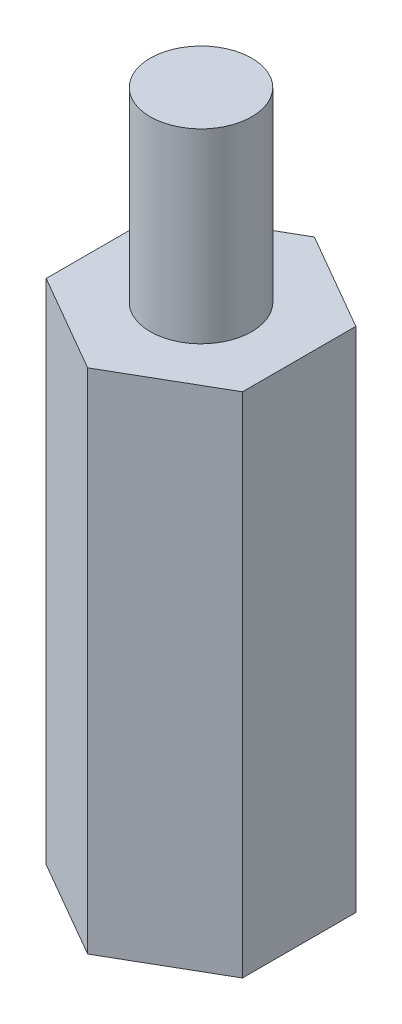
ISO-10303-21;
HEADER;
FILE_DESCRIPTION(('STEP AP214'),'2;1');
FILE_NAME('part.step','',(''),(''),'','','');
FILE_SCHEMA(('AUTOMOTIVE_DESIGN { 1 0 10303 214 1 1 1 1 }'));
ENDSEC;
DATA;
#1=APPLICATION_CONTEXT('core data for automotive mechanical design processes');
#2=APPLICATION_PROTOCOL_DEFINITION('international standard','automotive_design',2000,#1);
#3=PRODUCT_CONTEXT('',#1,'mechanical');
#4=PRODUCT('Part','Part','',(#3));
#5=PRODUCT_RELATED_PRODUCT_CATEGORY('part','',(#4));
#6=PRODUCT_DEFINITION_FORMATION('','',#4);
#7=PRODUCT_DEFINITION_CONTEXT('part definition',#1,'design');
#8=PRODUCT_DEFINITION('design','',#6,#7);
#9=PRODUCT_DEFINITION_SHAPE('','',#8);
#10=(LENGTH_UNIT() NAMED_UNIT(*) SI_UNIT(.MILLI.,.METRE.));
#11=(NAMED_UNIT(*) PLANE_ANGLE_UNIT() SI_UNIT($,.RADIAN.));
#12=(NAMED_UNIT(*) SI_UNIT($,.STERADIAN.) SOLID_ANGLE_UNIT());
#13=UNCERTAINTY_MEASURE_WITH_UNIT(LENGTH_MEASURE(1.E-05),#10,'distance_accuracy_value','');
#14=(GEOMETRIC_REPRESENTATION_CONTEXT(3) GLOBAL_UNCERTAINTY_ASSIGNED_CONTEXT((#13)) GLOBAL_UNIT_ASSIGNED_CONTEXT((#10,
#11,#12)) REPRESENTATION_CONTEXT('',''));
#15=CARTESIAN_POINT('',(0.,0.,0.));
#16=DIRECTION('',(0.,0.,1.));
#17=DIRECTION('',(1.,0.,0.));
#18=AXIS2_PLACEMENT_3D('',#15,#16,#17);
#19=CARTESIAN_POINT('',(0.,13.,0.));
#20=DIRECTION('',(0.,-1.,0.));
#21=DIRECTION('',(0.,0.,-1.));
#22=AXIS2_PLACEMENT_3D('',#19,#20,#21);
#23=CYLINDRICAL_SURFACE('',#22,1.5);
#24=CARTESIAN_POINT('',(0.,13.,0.));
#25=DIRECTION('',(0.,1.,0.));
#26=DIRECTION('',(0.,0.,1.));
#27=AXIS2_PLACEMENT_3D('',#24,#25,#26);
#28=CIRCLE('',#27,1.5);
#29=CARTESIAN_POINT('',(0.,13.,1.5));
#30=VERTEX_POINT('',#29);
#31=EDGE_CURVE('E11',#30,#30,#28,.T.);
#32=ORIENTED_EDGE('',*,*,#31,.F.);
#33=EDGE_LOOP('',(#32));
#34=FACE_BOUND('',#33,.T.);
#35=CARTESIAN_POINT('',(0.,7.5,0.));
#36=DIRECTION('',(0.,1.,0.));
#37=DIRECTION('',(0.,0.,1.));
#38=AXIS2_PLACEMENT_3D('',#35,#36,#37);
#39=CIRCLE('',#38,1.5);
#40=CARTESIAN_POINT('',(0.,7.5,1.5));
#41=VERTEX_POINT('',#40);
#42=EDGE_CURVE('E48',#41,#41,#39,.T.);
#43=ORIENTED_EDGE('',*,*,#42,.T.);
#44=EDGE_LOOP('',(#43));
#45=FACE_BOUND('',#44,.T.);
#46=ADVANCED_FACE('F45',(#34,#45),#23,.T.);
#47=CARTESIAN_POINT('',(0.,13.,0.));
#48=DIRECTION('',(0.,1.,0.));
#49=DIRECTION('',(0.,0.,1.));
#50=AXIS2_PLACEMENT_3D('',#47,#48,#49);
#51=PLANE('',#50);
#52=ORIENTED_EDGE('',*,*,#31,.T.);
#53=EDGE_LOOP('',(#52));
#54=FACE_BOUND('',#53,.T.);
#55=ADVANCED_FACE('F60',(#54),#51,.T.);
#56=CARTESIAN_POINT('',(0.,7.5,0.));
#57=DIRECTION('',(0.,1.,0.));
#58=DIRECTION('',(0.,0.,1.));
#59=AXIS2_PLACEMENT_3D('',#56,#57,#58);
#60=PLANE('',#59);
#61=ORIENTED_EDGE('',*,*,#42,.F.);
#62=EDGE_LOOP('',(#61));
#63=FACE_BOUND('',#62,.T.);
#64=ADVANCED_FACE('F58',(#63),#60,.F.);
#65=CLOSED_SHELL('',(#46,#55,#64));
#66=MANIFOLD_SOLID_BREP('B2',#65);
#67=CARTESIAN_POINT('',(0.,7.5,0.));
#68=DIRECTION('',(0.,1.,0.));
#69=DIRECTION('',(0.,0.,1.));
#70=AXIS2_PLACEMENT_3D('',#67,#68,#69);
#71=PLANE('',#70);
#72=DIRECTION('',(0.866025403784442,0.,0.499999999999995));
#73=VECTOR('',#72,1.);
#74=CARTESIAN_POINT('',(-2.89999999999998,7.5,1.67431578064995));
#75=LINE('',#74,#73);
#76=CARTESIAN_POINT('',(-2.89999999999998,7.5,1.67431578064995));
#77=VERTEX_POINT('',#76);
#78=CARTESIAN_POINT('',(0.,7.5,3.34863156129983));
#79=VERTEX_POINT('',#78);
#80=EDGE_CURVE('E188',#77,#79,#75,.T.);
#81=ORIENTED_EDGE('',*,*,#80,.T.);
#82=DIRECTION('',(0.866025403784438,0.,-0.500000000000001));
#83=VECTOR('',#82,1.);
#84=CARTESIAN_POINT('',(0.,7.5,3.34863156129983));
#85=LINE('',#84,#83);
#86=CARTESIAN_POINT('',(2.90000000000001,7.5,1.67431578064991));
#87=VERTEX_POINT('',#86);
#88=EDGE_CURVE('E146',#79,#87,#85,.T.);
#89=ORIENTED_EDGE('',*,*,#88,.T.);
#90=DIRECTION('',(0.,0.,-1.));
#91=VECTOR('',#90,1.);
#92=CARTESIAN_POINT('',(2.90000000000001,7.5,1.67431578064991));
#93=LINE('',#92,#91);
#94=CARTESIAN_POINT('',(2.89999999999999,7.5,-1.67431578064993));
#95=VERTEX_POINT('',#94);
#96=EDGE_CURVE('E159',#87,#95,#93,.T.);
#97=ORIENTED_EDGE('',*,*,#96,.T.);
#98=DIRECTION('',(-0.866025403784442,0.,-0.499999999999995));
#99=VECTOR('',#98,1.);
#100=CARTESIAN_POINT('',(2.89999999999999,7.5,-1.67431578064993));
#101=LINE('',#100,#99);
#102=CARTESIAN_POINT('',(0.,7.5,-3.34863156129983));
#103=VERTEX_POINT('',#102);
#104=EDGE_CURVE('E153',#95,#103,#101,.T.);
#105=ORIENTED_EDGE('',*,*,#104,.T.);
#106=DIRECTION('',(-0.866025403784435,0.,0.500000000000007));
#107=VECTOR('',#106,1.);
#108=CARTESIAN_POINT('',(0.,7.5,-3.34863156129983));
#109=LINE('',#108,#107);
#110=CARTESIAN_POINT('',(-2.90000000000002,7.5,-1.67431578064989));
#111=VERTEX_POINT('',#110);
#112=EDGE_CURVE('E157',#103,#111,#109,.T.);
#113=ORIENTED_EDGE('',*,*,#112,.T.);
#114=DIRECTION('',(0.,0.,1.));
#115=VECTOR('',#114,1.);
#116=CARTESIAN_POINT('',(-2.90000000000002,7.5,-1.67431578064989));
#117=LINE('',#116,#115);
#118=EDGE_CURVE('E109',#111,#77,#117,.T.);
#119=ORIENTED_EDGE('',*,*,#118,.T.);
#120=EDGE_LOOP('',(#81,#89,#97,#105,#113,#119));
#121=FACE_BOUND('',#120,.T.);
#122=CARTESIAN_POINT('',(0.,7.5,0.));
#123=DIRECTION('',(0.,1.,0.));
#124=DIRECTION('',(0.,0.,1.));
#125=AXIS2_PLACEMENT_3D('',#122,#123,#124);
#126=CIRCLE('',#125,1.5);
#127=CARTESIAN_POINT('',(0.,7.5,1.5));
#128=VERTEX_POINT('',#127);
#129=EDGE_CURVE('E181',#128,#128,#126,.T.);
#130=ORIENTED_EDGE('',*,*,#129,.F.);
#131=EDGE_LOOP('',(#130));
#132=FACE_BOUND('',#131,.T.);
#133=ADVANCED_FACE('F92',(#121,#132),#71,.T.);
#134=CARTESIAN_POINT('',(0.,-7.5,0.));
#135=DIRECTION('',(0.,1.,0.));
#136=DIRECTION('',(0.,0.,1.));
#137=AXIS2_PLACEMENT_3D('',#134,#135,#136);
#138=PLANE('',#137);
#139=DIRECTION('',(0.866025403784442,0.,0.499999999999995));
#140=VECTOR('',#139,1.);
#141=CARTESIAN_POINT('',(-2.89999999999998,-7.5,1.67431578064995));
#142=LINE('',#141,#140);
#143=CARTESIAN_POINT('',(-2.89999999999998,-7.5,1.67431578064995));
#144=VERTEX_POINT('',#143);
#145=CARTESIAN_POINT('',(0.,-7.5,3.34863156129983));
#146=VERTEX_POINT('',#145);
#147=EDGE_CURVE('E177',#144,#146,#142,.T.);
#148=ORIENTED_EDGE('',*,*,#147,.F.);
#149=DIRECTION('',(0.,0.,1.));
#150=VECTOR('',#149,1.);
#151=CARTESIAN_POINT('',(-2.90000000000002,-7.5,-1.67431578064989));
#152=LINE('',#151,#150);
#153=CARTESIAN_POINT('',(-2.90000000000002,-7.5,-1.67431578064989));
#154=VERTEX_POINT('',#153);
#155=EDGE_CURVE('E138',#154,#144,#152,.T.);
#156=ORIENTED_EDGE('',*,*,#155,.F.);
#157=DIRECTION('',(-0.866025403784435,0.,0.500000000000007));
#158=VECTOR('',#157,1.);
#159=CARTESIAN_POINT('',(0.,-7.5,-3.34863156129983));
#160=LINE('',#159,#158);
#161=CARTESIAN_POINT('',(0.,-7.5,-3.34863156129983));
#162=VERTEX_POINT('',#161);
#163=EDGE_CURVE('E132',#162,#154,#160,.T.);
#164=ORIENTED_EDGE('',*,*,#163,.F.);
#165=DIRECTION('',(-0.866025403784442,0.,-0.499999999999995));
#166=VECTOR('',#165,1.);
#167=CARTESIAN_POINT('',(2.89999999999999,-7.5,-1.67431578064993));
#168=LINE('',#167,#166);
#169=CARTESIAN_POINT('',(2.89999999999999,-7.5,-1.67431578064993));
#170=VERTEX_POINT('',#169);
#171=EDGE_CURVE('E167',#170,#162,#168,.T.);
#172=ORIENTED_EDGE('',*,*,#171,.F.);
#173=DIRECTION('',(0.,0.,-1.));
#174=VECTOR('',#173,1.);
#175=CARTESIAN_POINT('',(2.90000000000001,-7.5,1.67431578064991));
#176=LINE('',#175,#174);
#177=CARTESIAN_POINT('',(2.90000000000001,-7.5,1.67431578064991));
#178=VERTEX_POINT('',#177);
#179=EDGE_CURVE('E183',#178,#170,#176,.T.);
#180=ORIENTED_EDGE('',*,*,#179,.F.);
#181=DIRECTION('',(0.866025403784438,0.,-0.500000000000001));
#182=VECTOR('',#181,1.);
#183=CARTESIAN_POINT('',(0.,-7.5,3.34863156129983));
#184=LINE('',#183,#182);
#185=EDGE_CURVE('E180',#146,#178,#184,.T.);
#186=ORIENTED_EDGE('',*,*,#185,.F.);
#187=EDGE_LOOP('',(#148,#156,#164,#172,#180,#186));
#188=FACE_BOUND('',#187,.T.);
#189=CARTESIAN_POINT('',(0.,-7.5,0.));
#190=DIRECTION('',(0.,1.,0.));
#191=DIRECTION('',(0.,0.,1.));
#192=AXIS2_PLACEMENT_3D('',#189,#190,#191);
#193=CIRCLE('',#192,1.5);
#194=CARTESIAN_POINT('',(0.,-7.5,1.5));
#195=VERTEX_POINT('',#194);
#196=EDGE_CURVE('E299',#195,#195,#193,.T.);
#197=ORIENTED_EDGE('',*,*,#196,.T.);
#198=EDGE_LOOP('',(#197));
#199=FACE_BOUND('',#198,.T.);
#200=ADVANCED_FACE('F197',(#188,#199),#138,.F.);
#201=CARTESIAN_POINT('',(-2.89999999999998,7.5,1.67431578064995));
#202=DIRECTION('',(0.499999999999995,0.,-0.866025403784442));
#203=DIRECTION('',(-0.866025403784442,0.,-0.499999999999995));
#204=AXIS2_PLACEMENT_3D('',#201,#202,#203);
#205=PLANE('',#204);
#206=ORIENTED_EDGE('',*,*,#147,.T.);
#207=DIRECTION('',(0.,-1.,0.));
#208=VECTOR('',#207,1.);
#209=CARTESIAN_POINT('',(0.,7.5,3.34863156129983));
#210=LINE('',#209,#208);
#211=EDGE_CURVE('E43',#79,#146,#210,.T.);
#212=ORIENTED_EDGE('',*,*,#211,.F.);
#213=ORIENTED_EDGE('',*,*,#80,.F.);
#214=DIRECTION('',(0.,-1.,0.));
#215=VECTOR('',#214,1.);
#216=CARTESIAN_POINT('',(-2.89999999999998,7.5,1.67431578064995));
#217=LINE('',#216,#215);
#218=EDGE_CURVE('E173',#77,#144,#217,.T.);
#219=ORIENTED_EDGE('',*,*,#218,.T.);
#220=EDGE_LOOP('',(#206,#212,#213,#219));
#221=FACE_BOUND('',#220,.T.);
#222=ADVANCED_FACE('F94',(#221),#205,.F.);
#223=CARTESIAN_POINT('',(0.,7.5,3.34863156129983));
#224=DIRECTION('',(-0.500000000000001,0.,-0.866025403784438));
#225=DIRECTION('',(-0.866025403784438,0.,0.500000000000001));
#226=AXIS2_PLACEMENT_3D('',#223,#224,#225);
#227=PLANE('',#226);
#228=ORIENTED_EDGE('',*,*,#185,.T.);
#229=DIRECTION('',(0.,-1.,0.));
#230=VECTOR('',#229,1.);
#231=CARTESIAN_POINT('',(2.90000000000001,7.5,1.67431578064991));
#232=LINE('',#231,#230);
#233=EDGE_CURVE('E101',#87,#178,#232,.T.);
#234=ORIENTED_EDGE('',*,*,#233,.F.);
#235=ORIENTED_EDGE('',*,*,#88,.F.);
#236=ORIENTED_EDGE('',*,*,#211,.T.);
#237=EDGE_LOOP('',(#228,#234,#235,#236));
#238=FACE_BOUND('',#237,.T.);
#239=ADVANCED_FACE('F222',(#238),#227,.F.);
#240=CARTESIAN_POINT('',(2.90000000000001,7.5,1.67431578064991));
#241=DIRECTION('',(-1.,0.,0.));
#242=DIRECTION('',(0.,0.,1.));
#243=AXIS2_PLACEMENT_3D('',#240,#241,#242);
#244=PLANE('',#243);
#245=ORIENTED_EDGE('',*,*,#179,.T.);
#246=DIRECTION('',(0.,-1.,0.));
#247=VECTOR('',#246,1.);
#248=CARTESIAN_POINT('',(2.89999999999999,7.5,-1.67431578064993));
#249=LINE('',#248,#247);
#250=EDGE_CURVE('E168',#95,#170,#249,.T.);
#251=ORIENTED_EDGE('',*,*,#250,.F.);
#252=ORIENTED_EDGE('',*,*,#96,.F.);
#253=ORIENTED_EDGE('',*,*,#233,.T.);
#254=EDGE_LOOP('',(#245,#251,#252,#253));
#255=FACE_BOUND('',#254,.T.);
#256=ADVANCED_FACE('F194',(#255),#244,.F.);
#257=CARTESIAN_POINT('',(2.89999999999999,7.5,-1.67431578064993));
#258=DIRECTION('',(-0.499999999999995,0.,0.866025403784441));
#259=DIRECTION('',(0.866025403784442,0.,0.499999999999995));
#260=AXIS2_PLACEMENT_3D('',#257,#258,#259);
#261=PLANE('',#260);
#262=ORIENTED_EDGE('',*,*,#171,.T.);
#263=DIRECTION('',(0.,-1.,0.));
#264=VECTOR('',#263,1.);
#265=CARTESIAN_POINT('',(0.,7.5,-3.34863156129983));
#266=LINE('',#265,#264);
#267=EDGE_CURVE('E164',#103,#162,#266,.T.);
#268=ORIENTED_EDGE('',*,*,#267,.F.);
#269=ORIENTED_EDGE('',*,*,#104,.F.);
#270=ORIENTED_EDGE('',*,*,#250,.T.);
#271=EDGE_LOOP('',(#262,#268,#269,#270));
#272=FACE_BOUND('',#271,.T.);
#273=ADVANCED_FACE('F165',(#272),#261,.F.);
#274=CARTESIAN_POINT('',(0.,7.5,-3.34863156129983));
#275=DIRECTION('',(0.500000000000007,0.,0.866025403784435));
#276=DIRECTION('',(0.866025403784435,0.,-0.500000000000007));
#277=AXIS2_PLACEMENT_3D('',#274,#275,#276);
#278=PLANE('',#277);
#279=ORIENTED_EDGE('',*,*,#163,.T.);
#280=DIRECTION('',(0.,-1.,0.));
#281=VECTOR('',#280,1.);
#282=CARTESIAN_POINT('',(-2.90000000000002,7.5,-1.67431578064989));
#283=LINE('',#282,#281);
#284=EDGE_CURVE('E169',#111,#154,#283,.T.);
#285=ORIENTED_EDGE('',*,*,#284,.F.);
#286=ORIENTED_EDGE('',*,*,#112,.F.);
#287=ORIENTED_EDGE('',*,*,#267,.T.);
#288=EDGE_LOOP('',(#279,#285,#286,#287));
#289=FACE_BOUND('',#288,.T.);
#290=ADVANCED_FACE('F171',(#289),#278,.F.);
#291=CARTESIAN_POINT('',(-2.90000000000002,7.5,-1.67431578064989));
#292=DIRECTION('',(1.,0.,0.));
#293=DIRECTION('',(0.,0.,-1.));
#294=AXIS2_PLACEMENT_3D('',#291,#292,#293);
#295=PLANE('',#294);
#296=ORIENTED_EDGE('',*,*,#155,.T.);
#297=ORIENTED_EDGE('',*,*,#218,.F.);
#298=ORIENTED_EDGE('',*,*,#118,.F.);
#299=ORIENTED_EDGE('',*,*,#284,.T.);
#300=EDGE_LOOP('',(#296,#297,#298,#299));
#301=FACE_BOUND('',#300,.T.);
#302=ADVANCED_FACE('F202',(#301),#295,.F.);
#303=CARTESIAN_POINT('',(0.,7.5,0.));
#304=DIRECTION('',(0.,-1.,0.));
#305=DIRECTION('',(0.,0.,-1.));
#306=AXIS2_PLACEMENT_3D('',#303,#304,#305);
#307=CYLINDRICAL_SURFACE('',#306,1.5);
#308=ORIENTED_EDGE('',*,*,#129,.T.);
#309=EDGE_LOOP('',(#308));
#310=FACE_BOUND('',#309,.T.);
#311=ORIENTED_EDGE('',*,*,#196,.F.);
#312=EDGE_LOOP('',(#311));
#313=FACE_BOUND('',#312,.T.);
#314=ADVANCED_FACE('F204',(#310,#313),#307,.F.);
#315=CLOSED_SHELL('',(#133,#200,#222,#239,#256,#273,#290,#302,#314));
#316=MANIFOLD_SOLID_BREP('B6',#315);
#317=ADVANCED_BREP_SHAPE_REPRESENTATION('',(#18,#66,#316),#14);
#318=SHAPE_DEFINITION_REPRESENTATION(#9,#317);
ENDSEC;
END-ISO-10303-21;
